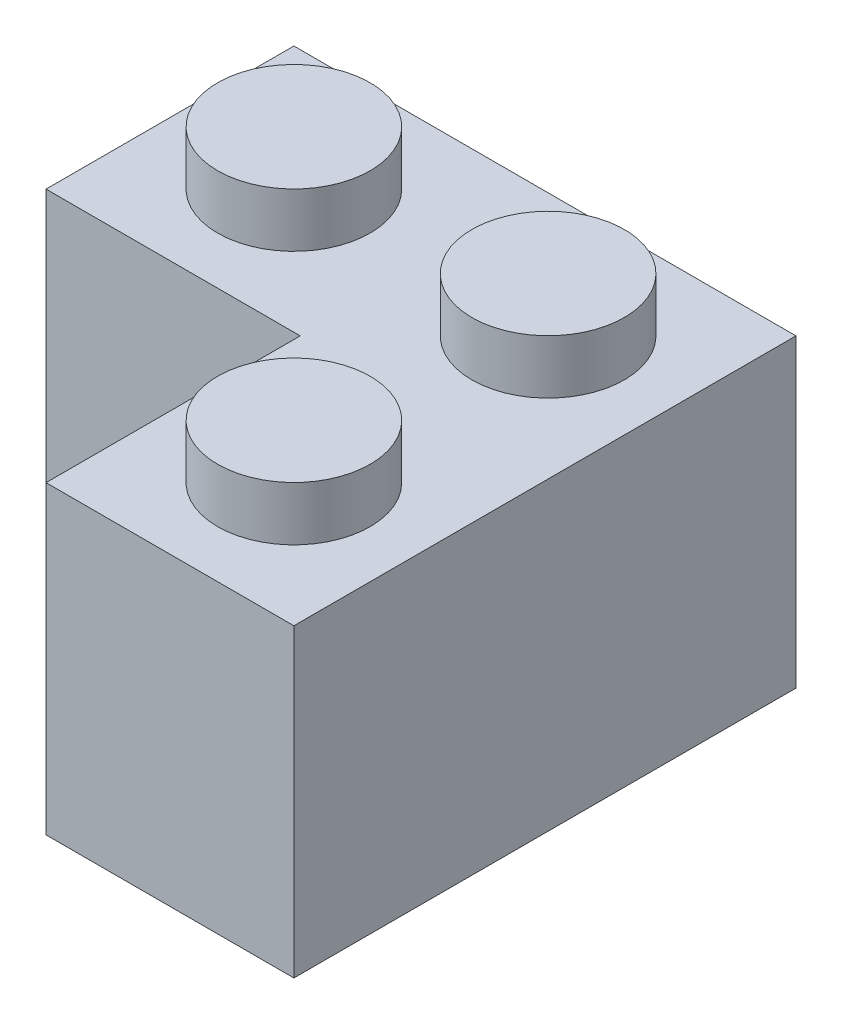
ISO-10303-21;
HEADER;
FILE_DESCRIPTION(('STEP AP214'),'2;1');
FILE_NAME('part.step','',(''),(''),'','','');
FILE_SCHEMA(('AUTOMOTIVE_DESIGN { 1 0 10303 214 1 1 1 1 }'));
ENDSEC;
DATA;
#1=APPLICATION_CONTEXT('core data for automotive mechanical design processes');
#2=APPLICATION_PROTOCOL_DEFINITION('international standard','automotive_design',2000,#1);
#3=PRODUCT_CONTEXT('',#1,'mechanical');
#4=PRODUCT('Part','Part','',(#3));
#5=PRODUCT_RELATED_PRODUCT_CATEGORY('part','',(#4));
#6=PRODUCT_DEFINITION_FORMATION('','',#4);
#7=PRODUCT_DEFINITION_CONTEXT('part definition',#1,'design');
#8=PRODUCT_DEFINITION('design','',#6,#7);
#9=PRODUCT_DEFINITION_SHAPE('','',#8);
#10=(LENGTH_UNIT() NAMED_UNIT(*) SI_UNIT(.MILLI.,.METRE.));
#11=(NAMED_UNIT(*) PLANE_ANGLE_UNIT() SI_UNIT($,.RADIAN.));
#12=(NAMED_UNIT(*) SI_UNIT($,.STERADIAN.) SOLID_ANGLE_UNIT());
#13=UNCERTAINTY_MEASURE_WITH_UNIT(LENGTH_MEASURE(1.E-05),#10,'distance_accuracy_value','');
#14=(GEOMETRIC_REPRESENTATION_CONTEXT(3) GLOBAL_UNCERTAINTY_ASSIGNED_CONTEXT((#13)) GLOBAL_UNIT_ASSIGNED_CONTEXT((#10,
#11,#12)) REPRESENTATION_CONTEXT('',''));
#15=CARTESIAN_POINT('',(0.,0.,0.));
#16=DIRECTION('',(0.,0.,1.));
#17=DIRECTION('',(1.,0.,0.));
#18=AXIS2_PLACEMENT_3D('',#15,#16,#17);
#19=CARTESIAN_POINT('',(-7.9,9.6,7.9));
#20=DIRECTION('',(1.,0.,0.));
#21=DIRECTION('',(0.,0.,-1.));
#22=AXIS2_PLACEMENT_3D('',#19,#20,#21);
#23=PLANE('',#22);
#24=DIRECTION('',(0.,1.,0.));
#25=VECTOR('',#24,1.);
#26=CARTESIAN_POINT('',(-7.9,0.,-0.0999999999999977));
#27=LINE('',#26,#25);
#28=CARTESIAN_POINT('',(-7.9,0.,-0.0999999999999977));
#29=VERTEX_POINT('',#28);
#30=CARTESIAN_POINT('',(-7.9,9.6,-0.0999999999999977));
#31=VERTEX_POINT('',#30);
#32=EDGE_CURVE('E100',#29,#31,#27,.T.);
#33=ORIENTED_EDGE('',*,*,#32,.T.);
#34=DIRECTION('',(0.,0.,1.));
#35=VECTOR('',#34,1.);
#36=CARTESIAN_POINT('',(-7.9,9.6,7.9));
#37=LINE('',#36,#35);
#38=CARTESIAN_POINT('',(-7.9,9.6,-7.9));
#39=VERTEX_POINT('',#38);
#40=EDGE_CURVE('E118',#39,#31,#37,.T.);
#41=ORIENTED_EDGE('',*,*,#40,.F.);
#42=DIRECTION('',(0.,-1.,0.));
#43=VECTOR('',#42,1.);
#44=CARTESIAN_POINT('',(-7.9,9.6,-7.9));
#45=LINE('',#44,#43);
#46=CARTESIAN_POINT('',(-7.9,0.,-7.9));
#47=VERTEX_POINT('',#46);
#48=EDGE_CURVE('E119',#39,#47,#45,.T.);
#49=ORIENTED_EDGE('',*,*,#48,.T.);
#50=DIRECTION('',(0.,0.,1.));
#51=VECTOR('',#50,1.);
#52=CARTESIAN_POINT('',(-7.9,0.,7.9));
#53=LINE('',#52,#51);
#54=EDGE_CURVE('E110',#47,#29,#53,.T.);
#55=ORIENTED_EDGE('',*,*,#54,.T.);
#56=EDGE_LOOP('',(#33,#41,#49,#55));
#57=FACE_BOUND('',#56,.T.);
#58=ADVANCED_FACE('F33',(#57),#23,.F.);
#59=CARTESIAN_POINT('',(0.,9.6,0.));
#60=DIRECTION('',(0.,1.,0.));
#61=DIRECTION('',(0.,0.,1.));
#62=AXIS2_PLACEMENT_3D('',#59,#60,#61);
#63=PLANE('',#62);
#64=CARTESIAN_POINT('',(4.00000000000009,9.6,4.));
#65=DIRECTION('',(0.,1.,0.));
#66=DIRECTION('',(0.,0.,1.));
#67=AXIS2_PLACEMENT_3D('',#64,#65,#66);
#68=CIRCLE('',#67,2.4);
#69=CARTESIAN_POINT('',(4.00000000000009,9.6,6.4));
#70=VERTEX_POINT('',#69);
#71=EDGE_CURVE('E215',#70,#70,#68,.T.);
#72=ORIENTED_EDGE('',*,*,#71,.F.);
#73=EDGE_LOOP('',(#72));
#74=FACE_BOUND('',#73,.T.);
#75=CARTESIAN_POINT('',(4.,9.6,-4.));
#76=DIRECTION('',(0.,1.,0.));
#77=DIRECTION('',(0.,0.,1.));
#78=AXIS2_PLACEMENT_3D('',#75,#76,#77);
#79=CIRCLE('',#78,2.4);
#80=CARTESIAN_POINT('',(4.,9.6,-1.6));
#81=VERTEX_POINT('',#80);
#82=EDGE_CURVE('E237',#81,#81,#79,.T.);
#83=ORIENTED_EDGE('',*,*,#82,.F.);
#84=EDGE_LOOP('',(#83));
#85=FACE_BOUND('',#84,.T.);
#86=CARTESIAN_POINT('',(-4.,9.6,-4.));
#87=DIRECTION('',(0.,1.,0.));
#88=DIRECTION('',(0.,0.,1.));
#89=AXIS2_PLACEMENT_3D('',#86,#87,#88);
#90=CIRCLE('',#89,2.4);
#91=CARTESIAN_POINT('',(-4.,9.6,-1.6));
#92=VERTEX_POINT('',#91);
#93=EDGE_CURVE('E242',#92,#92,#90,.T.);
#94=ORIENTED_EDGE('',*,*,#93,.F.);
#95=EDGE_LOOP('',(#94));
#96=FACE_BOUND('',#95,.T.);
#97=ORIENTED_EDGE('',*,*,#40,.T.);
#98=DIRECTION('',(1.,0.,0.));
#99=VECTOR('',#98,1.);
#100=CARTESIAN_POINT('',(-7.9,9.6,-0.0999999999999977));
#101=LINE('',#100,#99);
#102=CARTESIAN_POINT('',(0.100000000000001,9.6,-0.0999999999999977));
#103=VERTEX_POINT('',#102);
#104=EDGE_CURVE('E248',#31,#103,#101,.T.);
#105=ORIENTED_EDGE('',*,*,#104,.T.);
#106=DIRECTION('',(0.,0.,-1.));
#107=VECTOR('',#106,1.);
#108=CARTESIAN_POINT('',(0.100000000000001,9.6,7.9));
#109=LINE('',#108,#107);
#110=CARTESIAN_POINT('',(0.100000000000001,9.6,7.9));
#111=VERTEX_POINT('',#110);
#112=EDGE_CURVE('E251',#111,#103,#109,.T.);
#113=ORIENTED_EDGE('',*,*,#112,.F.);
#114=DIRECTION('',(1.,0.,0.));
#115=VECTOR('',#114,1.);
#116=CARTESIAN_POINT('',(7.9,9.6,7.9));
#117=LINE('',#116,#115);
#118=CARTESIAN_POINT('',(7.9,9.6,7.9));
#119=VERTEX_POINT('',#118);
#120=EDGE_CURVE('E78',#111,#119,#117,.T.);
#121=ORIENTED_EDGE('',*,*,#120,.T.);
#122=DIRECTION('',(0.,0.,-1.));
#123=VECTOR('',#122,1.);
#124=CARTESIAN_POINT('',(7.9,9.6,7.9));
#125=LINE('',#124,#123);
#126=CARTESIAN_POINT('',(7.9,9.6,-7.9));
#127=VERTEX_POINT('',#126);
#128=EDGE_CURVE('E130',#119,#127,#125,.T.);
#129=ORIENTED_EDGE('',*,*,#128,.T.);
#130=DIRECTION('',(-1.,0.,0.));
#131=VECTOR('',#130,1.);
#132=CARTESIAN_POINT('',(7.9,9.6,-7.9));
#133=LINE('',#132,#131);
#134=EDGE_CURVE('E56',#127,#39,#133,.T.);
#135=ORIENTED_EDGE('',*,*,#134,.T.);
#136=EDGE_LOOP('',(#97,#105,#113,#121,#129,#135));
#137=FACE_BOUND('',#136,.T.);
#138=ADVANCED_FACE('F134',(#74,#85,#96,#137),#63,.T.);
#139=CARTESIAN_POINT('',(0.,0.,0.));
#140=DIRECTION('',(0.,1.,0.));
#141=DIRECTION('',(0.,0.,1.));
#142=AXIS2_PLACEMENT_3D('',#139,#140,#141);
#143=PLANE('',#142);
#144=CARTESIAN_POINT('',(-4.,0.,-4.));
#145=DIRECTION('',(0.,-1.,0.));
#146=DIRECTION('',(0.,0.,-1.));
#147=AXIS2_PLACEMENT_3D('',#144,#145,#146);
#148=CIRCLE('',#147,2.5);
#149=CARTESIAN_POINT('',(-4.,0.,-6.5));
#150=VERTEX_POINT('',#149);
#151=EDGE_CURVE('E216',#150,#150,#148,.T.);
#152=ORIENTED_EDGE('',*,*,#151,.F.);
#153=EDGE_LOOP('',(#152));
#154=FACE_BOUND('',#153,.T.);
#155=CARTESIAN_POINT('',(4.,0.,-4.));
#156=DIRECTION('',(0.,-1.,0.));
#157=DIRECTION('',(0.,0.,-1.));
#158=AXIS2_PLACEMENT_3D('',#155,#156,#157);
#159=CIRCLE('',#158,2.5);
#160=CARTESIAN_POINT('',(4.,0.,-6.5));
#161=VERTEX_POINT('',#160);
#162=EDGE_CURVE('E227',#161,#161,#159,.T.);
#163=ORIENTED_EDGE('',*,*,#162,.F.);
#164=EDGE_LOOP('',(#163));
#165=FACE_BOUND('',#164,.T.);
#166=CARTESIAN_POINT('',(3.99999999999997,0.,4.));
#167=DIRECTION('',(0.,-1.,0.));
#168=DIRECTION('',(0.,0.,-1.));
#169=AXIS2_PLACEMENT_3D('',#166,#167,#168);
#170=CIRCLE('',#169,2.5);
#171=CARTESIAN_POINT('',(3.99999999999997,0.,1.5));
#172=VERTEX_POINT('',#171);
#173=EDGE_CURVE('E233',#172,#172,#170,.T.);
#174=ORIENTED_EDGE('',*,*,#173,.F.);
#175=EDGE_LOOP('',(#174));
#176=FACE_BOUND('',#175,.T.);
#177=DIRECTION('',(1.,0.,0.));
#178=VECTOR('',#177,1.);
#179=CARTESIAN_POINT('',(-7.9,0.,-0.0999999999999977));
#180=LINE('',#179,#178);
#181=CARTESIAN_POINT('',(0.100000000000001,0.,-0.0999999999999977));
#182=VERTEX_POINT('',#181);
#183=EDGE_CURVE('E101',#29,#182,#180,.T.);
#184=ORIENTED_EDGE('',*,*,#183,.F.);
#185=ORIENTED_EDGE('',*,*,#54,.F.);
#186=DIRECTION('',(-1.,0.,0.));
#187=VECTOR('',#186,1.);
#188=CARTESIAN_POINT('',(7.9,0.,-7.9));
#189=LINE('',#188,#187);
#190=CARTESIAN_POINT('',(7.9,0.,-7.9));
#191=VERTEX_POINT('',#190);
#192=EDGE_CURVE('E73',#191,#47,#189,.T.);
#193=ORIENTED_EDGE('',*,*,#192,.F.);
#194=DIRECTION('',(0.,0.,-1.));
#195=VECTOR('',#194,1.);
#196=CARTESIAN_POINT('',(7.9,0.,7.9));
#197=LINE('',#196,#195);
#198=CARTESIAN_POINT('',(7.9,0.,7.9));
#199=VERTEX_POINT('',#198);
#200=EDGE_CURVE('E109',#199,#191,#197,.T.);
#201=ORIENTED_EDGE('',*,*,#200,.F.);
#202=DIRECTION('',(1.,0.,0.));
#203=VECTOR('',#202,1.);
#204=CARTESIAN_POINT('',(7.9,0.,7.9));
#205=LINE('',#204,#203);
#206=CARTESIAN_POINT('',(0.100000000000001,0.,7.9));
#207=VERTEX_POINT('',#206);
#208=EDGE_CURVE('E105',#207,#199,#205,.T.);
#209=ORIENTED_EDGE('',*,*,#208,.F.);
#210=DIRECTION('',(0.,0.,-1.));
#211=VECTOR('',#210,1.);
#212=CARTESIAN_POINT('',(0.100000000000001,0.,7.9));
#213=LINE('',#212,#211);
#214=EDGE_CURVE('E93',#207,#182,#213,.T.);
#215=ORIENTED_EDGE('',*,*,#214,.T.);
#216=EDGE_LOOP('',(#184,#185,#193,#201,#209,#215));
#217=FACE_BOUND('',#216,.T.);
#218=ADVANCED_FACE('F108',(#154,#165,#176,#217),#143,.F.);
#219=CARTESIAN_POINT('',(7.9,9.6,7.9));
#220=DIRECTION('',(0.,0.,-1.));
#221=DIRECTION('',(-1.,0.,0.));
#222=AXIS2_PLACEMENT_3D('',#219,#220,#221);
#223=PLANE('',#222);
#224=ORIENTED_EDGE('',*,*,#120,.F.);
#225=DIRECTION('',(0.,1.,0.));
#226=VECTOR('',#225,1.);
#227=CARTESIAN_POINT('',(0.100000000000001,0.,7.9));
#228=LINE('',#227,#226);
#229=EDGE_CURVE('E96',#207,#111,#228,.T.);
#230=ORIENTED_EDGE('',*,*,#229,.F.);
#231=ORIENTED_EDGE('',*,*,#208,.T.);
#232=DIRECTION('',(0.,-1.,0.));
#233=VECTOR('',#232,1.);
#234=CARTESIAN_POINT('',(7.9,9.6,7.9));
#235=LINE('',#234,#233);
#236=EDGE_CURVE('E11',#119,#199,#235,.T.);
#237=ORIENTED_EDGE('',*,*,#236,.F.);
#238=EDGE_LOOP('',(#224,#230,#231,#237));
#239=FACE_BOUND('',#238,.T.);
#240=ADVANCED_FACE('F104',(#239),#223,.F.);
#241=CARTESIAN_POINT('',(7.9,9.6,7.9));
#242=DIRECTION('',(-1.,0.,0.));
#243=DIRECTION('',(0.,0.,1.));
#244=AXIS2_PLACEMENT_3D('',#241,#242,#243);
#245=PLANE('',#244);
#246=ORIENTED_EDGE('',*,*,#200,.T.);
#247=DIRECTION('',(0.,-1.,0.));
#248=VECTOR('',#247,1.);
#249=CARTESIAN_POINT('',(7.9,9.6,-7.9));
#250=LINE('',#249,#248);
#251=EDGE_CURVE('E40',#127,#191,#250,.T.);
#252=ORIENTED_EDGE('',*,*,#251,.F.);
#253=ORIENTED_EDGE('',*,*,#128,.F.);
#254=ORIENTED_EDGE('',*,*,#236,.T.);
#255=EDGE_LOOP('',(#246,#252,#253,#254));
#256=FACE_BOUND('',#255,.T.);
#257=ADVANCED_FACE('F135',(#256),#245,.F.);
#258=CARTESIAN_POINT('',(7.9,9.6,-7.9));
#259=DIRECTION('',(0.,0.,1.));
#260=DIRECTION('',(1.,0.,0.));
#261=AXIS2_PLACEMENT_3D('',#258,#259,#260);
#262=PLANE('',#261);
#263=ORIENTED_EDGE('',*,*,#192,.T.);
#264=ORIENTED_EDGE('',*,*,#48,.F.);
#265=ORIENTED_EDGE('',*,*,#134,.F.);
#266=ORIENTED_EDGE('',*,*,#251,.T.);
#267=EDGE_LOOP('',(#263,#264,#265,#266));
#268=FACE_BOUND('',#267,.T.);
#269=ADVANCED_FACE('F121',(#268),#262,.F.);
#270=CARTESIAN_POINT('',(-7.9,0.,-0.0999999999999977));
#271=DIRECTION('',(0.,0.,1.));
#272=DIRECTION('',(1.,0.,0.));
#273=AXIS2_PLACEMENT_3D('',#270,#271,#272);
#274=PLANE('',#273);
#275=ORIENTED_EDGE('',*,*,#104,.F.);
#276=ORIENTED_EDGE('',*,*,#32,.F.);
#277=ORIENTED_EDGE('',*,*,#183,.T.);
#278=DIRECTION('',(0.,1.,0.));
#279=VECTOR('',#278,1.);
#280=CARTESIAN_POINT('',(0.100000000000001,0.,-0.0999999999999977));
#281=LINE('',#280,#279);
#282=EDGE_CURVE('E47',#182,#103,#281,.T.);
#283=ORIENTED_EDGE('',*,*,#282,.T.);
#284=EDGE_LOOP('',(#275,#276,#277,#283));
#285=FACE_BOUND('',#284,.T.);
#286=ADVANCED_FACE('F142',(#285),#274,.T.);
#287=CARTESIAN_POINT('',(0.100000000000001,0.,7.9));
#288=DIRECTION('',(1.,0.,0.));
#289=DIRECTION('',(0.,0.,-1.));
#290=AXIS2_PLACEMENT_3D('',#287,#288,#289);
#291=PLANE('',#290);
#292=ORIENTED_EDGE('',*,*,#112,.T.);
#293=ORIENTED_EDGE('',*,*,#282,.F.);
#294=ORIENTED_EDGE('',*,*,#214,.F.);
#295=ORIENTED_EDGE('',*,*,#229,.T.);
#296=EDGE_LOOP('',(#292,#293,#294,#295));
#297=FACE_BOUND('',#296,.T.);
#298=ADVANCED_FACE('F95',(#297),#291,.F.);
#299=CARTESIAN_POINT('',(-4.,11.3,-4.));
#300=DIRECTION('',(0.,-1.,0.));
#301=DIRECTION('',(0.,0.,-1.));
#302=AXIS2_PLACEMENT_3D('',#299,#300,#301);
#303=CYLINDRICAL_SURFACE('',#302,2.4);
#304=CARTESIAN_POINT('',(-4.,11.3,-4.));
#305=DIRECTION('',(0.,1.,0.));
#306=DIRECTION('',(0.,0.,1.));
#307=AXIS2_PLACEMENT_3D('',#304,#305,#306);
#308=CIRCLE('',#307,2.4);
#309=CARTESIAN_POINT('',(-4.,11.3,-1.6));
#310=VERTEX_POINT('',#309);
#311=EDGE_CURVE('E245',#310,#310,#308,.T.);
#312=ORIENTED_EDGE('',*,*,#311,.F.);
#313=EDGE_LOOP('',(#312));
#314=FACE_BOUND('',#313,.T.);
#315=ORIENTED_EDGE('',*,*,#93,.T.);
#316=EDGE_LOOP('',(#315));
#317=FACE_BOUND('',#316,.T.);
#318=ADVANCED_FACE('F163',(#314,#317),#303,.T.);
#319=CARTESIAN_POINT('',(-4.,11.3,-4.));
#320=DIRECTION('',(0.,1.,0.));
#321=DIRECTION('',(0.,0.,1.));
#322=AXIS2_PLACEMENT_3D('',#319,#320,#321);
#323=PLANE('',#322);
#324=ORIENTED_EDGE('',*,*,#311,.T.);
#325=EDGE_LOOP('',(#324));
#326=FACE_BOUND('',#325,.T.);
#327=ADVANCED_FACE('F166',(#326),#323,.T.);
#328=CARTESIAN_POINT('',(4.,11.3,-4.));
#329=DIRECTION('',(0.,-1.,0.));
#330=DIRECTION('',(0.,0.,-1.));
#331=AXIS2_PLACEMENT_3D('',#328,#329,#330);
#332=CYLINDRICAL_SURFACE('',#331,2.4);
#333=CARTESIAN_POINT('',(4.,11.3,-4.));
#334=DIRECTION('',(0.,1.,0.));
#335=DIRECTION('',(0.,0.,1.));
#336=AXIS2_PLACEMENT_3D('',#333,#334,#335);
#337=CIRCLE('',#336,2.4);
#338=CARTESIAN_POINT('',(4.,11.3,-1.6));
#339=VERTEX_POINT('',#338);
#340=EDGE_CURVE('E239',#339,#339,#337,.T.);
#341=ORIENTED_EDGE('',*,*,#340,.F.);
#342=EDGE_LOOP('',(#341));
#343=FACE_BOUND('',#342,.T.);
#344=ORIENTED_EDGE('',*,*,#82,.T.);
#345=EDGE_LOOP('',(#344));
#346=FACE_BOUND('',#345,.T.);
#347=ADVANCED_FACE('F170',(#343,#346),#332,.T.);
#348=CARTESIAN_POINT('',(4.,11.3,-4.));
#349=DIRECTION('',(0.,1.,0.));
#350=DIRECTION('',(0.,0.,1.));
#351=AXIS2_PLACEMENT_3D('',#348,#349,#350);
#352=PLANE('',#351);
#353=ORIENTED_EDGE('',*,*,#340,.T.);
#354=EDGE_LOOP('',(#353));
#355=FACE_BOUND('',#354,.T.);
#356=ADVANCED_FACE('F174',(#355),#352,.T.);
#357=CARTESIAN_POINT('',(4.00000000000009,11.3,4.));
#358=DIRECTION('',(0.,-1.,0.));
#359=DIRECTION('',(0.,0.,-1.));
#360=AXIS2_PLACEMENT_3D('',#357,#358,#359);
#361=CYLINDRICAL_SURFACE('',#360,2.4);
#362=CARTESIAN_POINT('',(4.00000000000009,11.3,4.));
#363=DIRECTION('',(0.,1.,0.));
#364=DIRECTION('',(0.,0.,1.));
#365=AXIS2_PLACEMENT_3D('',#362,#363,#364);
#366=CIRCLE('',#365,2.4);
#367=CARTESIAN_POINT('',(4.00000000000009,11.3,6.4));
#368=VERTEX_POINT('',#367);
#369=EDGE_CURVE('E219',#368,#368,#366,.T.);
#370=ORIENTED_EDGE('',*,*,#369,.F.);
#371=EDGE_LOOP('',(#370));
#372=FACE_BOUND('',#371,.T.);
#373=ORIENTED_EDGE('',*,*,#71,.T.);
#374=EDGE_LOOP('',(#373));
#375=FACE_BOUND('',#374,.T.);
#376=ADVANCED_FACE('F178',(#372,#375),#361,.T.);
#377=CARTESIAN_POINT('',(4.00000000000009,11.3,4.));
#378=DIRECTION('',(0.,1.,0.));
#379=DIRECTION('',(0.,0.,1.));
#380=AXIS2_PLACEMENT_3D('',#377,#378,#379);
#381=PLANE('',#380);
#382=ORIENTED_EDGE('',*,*,#369,.T.);
#383=EDGE_LOOP('',(#382));
#384=FACE_BOUND('',#383,.T.);
#385=ADVANCED_FACE('F182',(#384),#381,.T.);
#386=CARTESIAN_POINT('',(3.99999999999997,1.8,4.));
#387=DIRECTION('',(0.,-1.,0.));
#388=DIRECTION('',(0.,0.,-1.));
#389=AXIS2_PLACEMENT_3D('',#386,#387,#388);
#390=CYLINDRICAL_SURFACE('',#389,2.5);
#391=CARTESIAN_POINT('',(3.99999999999997,1.8,4.));
#392=DIRECTION('',(0.,-1.,0.));
#393=DIRECTION('',(0.,0.,-1.));
#394=AXIS2_PLACEMENT_3D('',#391,#392,#393);
#395=CIRCLE('',#394,2.5);
#396=CARTESIAN_POINT('',(3.99999999999997,1.8,1.5));
#397=VERTEX_POINT('',#396);
#398=EDGE_CURVE('E230',#397,#397,#395,.T.);
#399=ORIENTED_EDGE('',*,*,#398,.F.);
#400=EDGE_LOOP('',(#399));
#401=FACE_BOUND('',#400,.T.);
#402=ORIENTED_EDGE('',*,*,#173,.T.);
#403=EDGE_LOOP('',(#402));
#404=FACE_BOUND('',#403,.T.);
#405=ADVANCED_FACE('F186',(#401,#404),#390,.F.);
#406=CARTESIAN_POINT('',(3.99999999999997,1.8,4.));
#407=DIRECTION('',(0.,-1.,0.));
#408=DIRECTION('',(0.,0.,-1.));
#409=AXIS2_PLACEMENT_3D('',#406,#407,#408);
#410=PLANE('',#409);
#411=ORIENTED_EDGE('',*,*,#398,.T.);
#412=EDGE_LOOP('',(#411));
#413=FACE_BOUND('',#412,.T.);
#414=ADVANCED_FACE('F190',(#413),#410,.T.);
#415=CARTESIAN_POINT('',(4.,1.8,-4.));
#416=DIRECTION('',(0.,-1.,0.));
#417=DIRECTION('',(0.,0.,-1.));
#418=AXIS2_PLACEMENT_3D('',#415,#416,#417);
#419=CYLINDRICAL_SURFACE('',#418,2.5);
#420=CARTESIAN_POINT('',(4.,1.8,-4.));
#421=DIRECTION('',(0.,-1.,0.));
#422=DIRECTION('',(0.,0.,-1.));
#423=AXIS2_PLACEMENT_3D('',#420,#421,#422);
#424=CIRCLE('',#423,2.5);
#425=CARTESIAN_POINT('',(4.,1.8,-6.5));
#426=VERTEX_POINT('',#425);
#427=EDGE_CURVE('E222',#426,#426,#424,.T.);
#428=ORIENTED_EDGE('',*,*,#427,.F.);
#429=EDGE_LOOP('',(#428));
#430=FACE_BOUND('',#429,.T.);
#431=ORIENTED_EDGE('',*,*,#162,.T.);
#432=EDGE_LOOP('',(#431));
#433=FACE_BOUND('',#432,.T.);
#434=ADVANCED_FACE('F194',(#430,#433),#419,.F.);
#435=CARTESIAN_POINT('',(4.,1.8,-4.));
#436=DIRECTION('',(0.,-1.,0.));
#437=DIRECTION('',(0.,0.,-1.));
#438=AXIS2_PLACEMENT_3D('',#435,#436,#437);
#439=PLANE('',#438);
#440=ORIENTED_EDGE('',*,*,#427,.T.);
#441=EDGE_LOOP('',(#440));
#442=FACE_BOUND('',#441,.T.);
#443=ADVANCED_FACE('F198',(#442),#439,.T.);
#444=CARTESIAN_POINT('',(-4.,1.8,-4.));
#445=DIRECTION('',(0.,-1.,0.));
#446=DIRECTION('',(0.,0.,-1.));
#447=AXIS2_PLACEMENT_3D('',#444,#445,#446);
#448=CYLINDRICAL_SURFACE('',#447,2.5);
#449=CARTESIAN_POINT('',(-4.,1.8,-4.));
#450=DIRECTION('',(0.,-1.,0.));
#451=DIRECTION('',(0.,0.,-1.));
#452=AXIS2_PLACEMENT_3D('',#449,#450,#451);
#453=CIRCLE('',#452,2.5);
#454=CARTESIAN_POINT('',(-4.,1.8,-6.5));
#455=VERTEX_POINT('',#454);
#456=EDGE_CURVE('E214',#455,#455,#453,.T.);
#457=ORIENTED_EDGE('',*,*,#456,.F.);
#458=EDGE_LOOP('',(#457));
#459=FACE_BOUND('',#458,.T.);
#460=ORIENTED_EDGE('',*,*,#151,.T.);
#461=EDGE_LOOP('',(#460));
#462=FACE_BOUND('',#461,.T.);
#463=ADVANCED_FACE('F202',(#459,#462),#448,.F.);
#464=CARTESIAN_POINT('',(-4.,1.8,-4.));
#465=DIRECTION('',(0.,-1.,0.));
#466=DIRECTION('',(0.,0.,-1.));
#467=AXIS2_PLACEMENT_3D('',#464,#465,#466);
#468=PLANE('',#467);
#469=ORIENTED_EDGE('',*,*,#456,.T.);
#470=EDGE_LOOP('',(#469));
#471=FACE_BOUND('',#470,.T.);
#472=ADVANCED_FACE('F206',(#471),#468,.T.);
#473=CLOSED_SHELL('',(#58,#138,#218,#240,#257,#269,#286,#298,#318,#327,#347,#356,#376,#385,#405,
#414,#434,#443,#463,#472));
#474=MANIFOLD_SOLID_BREP('B2',#473);
#475=ADVANCED_BREP_SHAPE_REPRESENTATION('',(#18,#474),#14);
#476=SHAPE_DEFINITION_REPRESENTATION(#9,#475);
ENDSEC;
END-ISO-10303-21;
